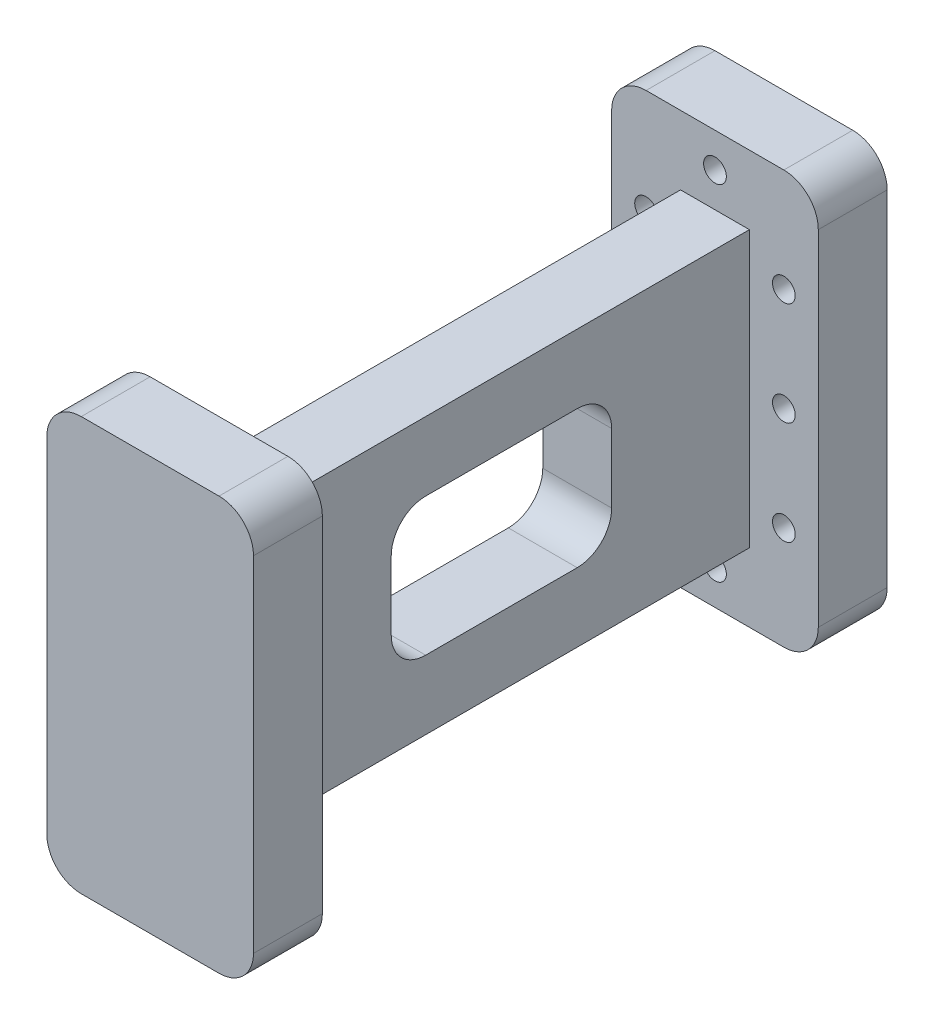
ISO-10303-21;
HEADER;
FILE_DESCRIPTION(('STEP AP214'),'2;1');
FILE_NAME('part.step','',(''),(''),'','','');
FILE_SCHEMA(('AUTOMOTIVE_DESIGN { 1 0 10303 214 1 1 1 1 }'));
ENDSEC;
DATA;
#1=APPLICATION_CONTEXT('core data for automotive mechanical design processes');
#2=APPLICATION_PROTOCOL_DEFINITION('international standard','automotive_design',2000,#1);
#3=PRODUCT_CONTEXT('',#1,'mechanical');
#4=PRODUCT('Part','Part','',(#3));
#5=PRODUCT_RELATED_PRODUCT_CATEGORY('part','',(#4));
#6=PRODUCT_DEFINITION_FORMATION('','',#4);
#7=PRODUCT_DEFINITION_CONTEXT('part definition',#1,'design');
#8=PRODUCT_DEFINITION('design','',#6,#7);
#9=PRODUCT_DEFINITION_SHAPE('','',#8);
#10=(LENGTH_UNIT() NAMED_UNIT(*) SI_UNIT(.MILLI.,.METRE.));
#11=(NAMED_UNIT(*) PLANE_ANGLE_UNIT() SI_UNIT($,.RADIAN.));
#12=(NAMED_UNIT(*) SI_UNIT($,.STERADIAN.) SOLID_ANGLE_UNIT());
#13=UNCERTAINTY_MEASURE_WITH_UNIT(LENGTH_MEASURE(1.E-05),#10,'distance_accuracy_value','');
#14=(GEOMETRIC_REPRESENTATION_CONTEXT(3) GLOBAL_UNCERTAINTY_ASSIGNED_CONTEXT((#13)) GLOBAL_UNIT_ASSIGNED_CONTEXT((#10,
#11,#12)) REPRESENTATION_CONTEXT('',''));
#15=CARTESIAN_POINT('',(0.,0.,0.));
#16=DIRECTION('',(0.,0.,1.));
#17=DIRECTION('',(1.,0.,0.));
#18=AXIS2_PLACEMENT_3D('',#15,#16,#17);
#19=CARTESIAN_POINT('',(-9.99999999999996,-30.,92.));
#20=DIRECTION('',(0.,1.,0.));
#21=DIRECTION('',(0.,0.,1.));
#22=AXIS2_PLACEMENT_3D('',#19,#20,#21);
#23=PLANE('',#22);
#24=DIRECTION('',(0.,0.,-1.));
#25=VECTOR('',#24,1.);
#26=CARTESIAN_POINT('',(9.99999999999997,-30.,92.));
#27=LINE('',#26,#25);
#28=CARTESIAN_POINT('',(9.99999999999997,-30.,9.99999999999999));
#29=VERTEX_POINT('',#28);
#30=CARTESIAN_POINT('',(9.99999999999997,-30.,0.));
#31=VERTEX_POINT('',#30);
#32=EDGE_CURVE('E261',#29,#31,#27,.T.);
#33=ORIENTED_EDGE('',*,*,#32,.F.);
#34=DIRECTION('',(-1.,0.,0.));
#35=VECTOR('',#34,1.);
#36=CARTESIAN_POINT('',(5.,-30.,9.99999999999999));
#37=LINE('',#36,#35);
#38=CARTESIAN_POINT('',(-9.99999999999996,-30.,9.99999999999999));
#39=VERTEX_POINT('',#38);
#40=EDGE_CURVE('E534',#29,#39,#37,.T.);
#41=ORIENTED_EDGE('',*,*,#40,.T.);
#42=DIRECTION('',(0.,0.,-1.));
#43=VECTOR('',#42,1.);
#44=CARTESIAN_POINT('',(-9.99999999999996,-30.,92.));
#45=LINE('',#44,#43);
#46=CARTESIAN_POINT('',(-9.99999999999996,-30.,0.));
#47=VERTEX_POINT('',#46);
#48=EDGE_CURVE('E265',#39,#47,#45,.T.);
#49=ORIENTED_EDGE('',*,*,#48,.T.);
#50=DIRECTION('',(1.,0.,0.));
#51=VECTOR('',#50,1.);
#52=CARTESIAN_POINT('',(-9.99999999999996,-30.,0.));
#53=LINE('',#52,#51);
#54=EDGE_CURVE('E300',#47,#31,#53,.T.);
#55=ORIENTED_EDGE('',*,*,#54,.T.);
#56=EDGE_LOOP('',(#33,#41,#49,#55));
#57=FACE_BOUND('',#56,.T.);
#58=ADVANCED_FACE('F39',(#57),#23,.F.);
#59=CARTESIAN_POINT('',(10.,-25.,92.));
#60=DIRECTION('',(0.,0.,-1.));
#61=DIRECTION('',(-1.,0.,0.));
#62=AXIS2_PLACEMENT_3D('',#59,#60,#61);
#63=CYLINDRICAL_SURFACE('',#62,5.);
#64=CARTESIAN_POINT('',(10.,-25.,9.99999999999999));
#65=DIRECTION('',(0.,0.,1.));
#66=DIRECTION('',(1.,0.,0.));
#67=AXIS2_PLACEMENT_3D('',#64,#65,#66);
#68=CIRCLE('',#67,5.);
#69=CARTESIAN_POINT('',(15.,-25.,10.));
#70=VERTEX_POINT('',#69);
#71=EDGE_CURVE('E233',#29,#70,#68,.T.);
#72=ORIENTED_EDGE('',*,*,#71,.F.);
#73=ORIENTED_EDGE('',*,*,#32,.T.);
#74=CARTESIAN_POINT('',(10.,-25.,0.));
#75=DIRECTION('',(0.,0.,1.));
#76=DIRECTION('',(1.,0.,0.));
#77=AXIS2_PLACEMENT_3D('',#74,#75,#76);
#78=CIRCLE('',#77,5.);
#79=CARTESIAN_POINT('',(15.,-25.,0.));
#80=VERTEX_POINT('',#79);
#81=EDGE_CURVE('E302',#31,#80,#78,.T.);
#82=ORIENTED_EDGE('',*,*,#81,.T.);
#83=DIRECTION('',(0.,0.,-1.));
#84=VECTOR('',#83,1.);
#85=CARTESIAN_POINT('',(15.,-25.,92.));
#86=LINE('',#85,#84);
#87=EDGE_CURVE('E253',#70,#80,#86,.T.);
#88=ORIENTED_EDGE('',*,*,#87,.F.);
#89=EDGE_LOOP('',(#72,#73,#82,#88));
#90=FACE_BOUND('',#89,.T.);
#91=ADVANCED_FACE('F572',(#90),#63,.T.);
#92=CARTESIAN_POINT('',(10.,25.,92.));
#93=DIRECTION('',(0.,0.,-1.));
#94=DIRECTION('',(-1.,0.,0.));
#95=AXIS2_PLACEMENT_3D('',#92,#93,#94);
#96=CYLINDRICAL_SURFACE('',#95,5.);
#97=CARTESIAN_POINT('',(10.,25.,9.99999999999999));
#98=DIRECTION('',(0.,0.,1.));
#99=DIRECTION('',(1.,0.,0.));
#100=AXIS2_PLACEMENT_3D('',#97,#98,#99);
#101=CIRCLE('',#100,5.);
#102=CARTESIAN_POINT('',(15.,25.,10.));
#103=VERTEX_POINT('',#102);
#104=CARTESIAN_POINT('',(9.99999999999997,30.,9.99999999999999));
#105=VERTEX_POINT('',#104);
#106=EDGE_CURVE('E224',#103,#105,#101,.T.);
#107=ORIENTED_EDGE('',*,*,#106,.F.);
#108=DIRECTION('',(0.,0.,-1.));
#109=VECTOR('',#108,1.);
#110=CARTESIAN_POINT('',(15.,25.,92.));
#111=LINE('',#110,#109);
#112=CARTESIAN_POINT('',(15.,25.,0.));
#113=VERTEX_POINT('',#112);
#114=EDGE_CURVE('E229',#103,#113,#111,.T.);
#115=ORIENTED_EDGE('',*,*,#114,.T.);
#116=CARTESIAN_POINT('',(10.,25.,0.));
#117=DIRECTION('',(0.,0.,1.));
#118=DIRECTION('',(-1.,0.,0.));
#119=AXIS2_PLACEMENT_3D('',#116,#117,#118);
#120=CIRCLE('',#119,5.);
#121=CARTESIAN_POINT('',(9.99999999999997,30.,0.));
#122=VERTEX_POINT('',#121);
#123=EDGE_CURVE('E309',#113,#122,#120,.T.);
#124=ORIENTED_EDGE('',*,*,#123,.T.);
#125=DIRECTION('',(0.,0.,-1.));
#126=VECTOR('',#125,1.);
#127=CARTESIAN_POINT('',(9.99999999999997,30.,92.));
#128=LINE('',#127,#126);
#129=EDGE_CURVE('E231',#105,#122,#128,.T.);
#130=ORIENTED_EDGE('',*,*,#129,.F.);
#131=EDGE_LOOP('',(#107,#115,#124,#130));
#132=FACE_BOUND('',#131,.T.);
#133=ADVANCED_FACE('F226',(#132),#96,.T.);
#134=CARTESIAN_POINT('',(-9.99999999999996,30.,92.));
#135=DIRECTION('',(0.,-1.,0.));
#136=DIRECTION('',(0.,0.,-1.));
#137=AXIS2_PLACEMENT_3D('',#134,#135,#136);
#138=PLANE('',#137);
#139=DIRECTION('',(-1.,0.,0.));
#140=VECTOR('',#139,1.);
#141=CARTESIAN_POINT('',(5.,30.,10.));
#142=LINE('',#141,#140);
#143=CARTESIAN_POINT('',(-9.99999999999996,30.,9.99999999999999));
#144=VERTEX_POINT('',#143);
#145=EDGE_CURVE('E336',#105,#144,#142,.T.);
#146=ORIENTED_EDGE('',*,*,#145,.F.);
#147=ORIENTED_EDGE('',*,*,#129,.T.);
#148=DIRECTION('',(-1.,0.,0.));
#149=VECTOR('',#148,1.);
#150=CARTESIAN_POINT('',(-9.99999999999996,30.,0.));
#151=LINE('',#150,#149);
#152=CARTESIAN_POINT('',(-9.99999999999996,30.,0.));
#153=VERTEX_POINT('',#152);
#154=EDGE_CURVE('E311',#122,#153,#151,.T.);
#155=ORIENTED_EDGE('',*,*,#154,.T.);
#156=DIRECTION('',(0.,0.,-1.));
#157=VECTOR('',#156,1.);
#158=CARTESIAN_POINT('',(-9.99999999999996,30.,92.));
#159=LINE('',#158,#157);
#160=EDGE_CURVE('E316',#144,#153,#159,.T.);
#161=ORIENTED_EDGE('',*,*,#160,.F.);
#162=EDGE_LOOP('',(#146,#147,#155,#161));
#163=FACE_BOUND('',#162,.T.);
#164=ADVANCED_FACE('F335',(#163),#138,.F.);
#165=CARTESIAN_POINT('',(-10.,25.,92.));
#166=DIRECTION('',(0.,0.,-1.));
#167=DIRECTION('',(-1.,0.,0.));
#168=AXIS2_PLACEMENT_3D('',#165,#166,#167);
#169=CYLINDRICAL_SURFACE('',#168,5.);
#170=DIRECTION('',(0.,0.,-1.));
#171=VECTOR('',#170,1.);
#172=CARTESIAN_POINT('',(-15.,25.,92.));
#173=LINE('',#172,#171);
#174=CARTESIAN_POINT('',(-15.,25.,10.));
#175=VERTEX_POINT('',#174);
#176=CARTESIAN_POINT('',(-15.,25.,0.));
#177=VERTEX_POINT('',#176);
#178=EDGE_CURVE('E47',#175,#177,#173,.T.);
#179=ORIENTED_EDGE('',*,*,#178,.F.);
#180=CARTESIAN_POINT('',(-10.,25.,9.99999999999999));
#181=DIRECTION('',(0.,0.,-1.));
#182=DIRECTION('',(-1.,0.,0.));
#183=AXIS2_PLACEMENT_3D('',#180,#181,#182);
#184=CIRCLE('',#183,5.);
#185=EDGE_CURVE('E409',#175,#144,#184,.T.);
#186=ORIENTED_EDGE('',*,*,#185,.T.);
#187=ORIENTED_EDGE('',*,*,#160,.T.);
#188=CARTESIAN_POINT('',(-10.,25.,0.));
#189=DIRECTION('',(0.,0.,1.));
#190=DIRECTION('',(-1.,0.,0.));
#191=AXIS2_PLACEMENT_3D('',#188,#189,#190);
#192=CIRCLE('',#191,5.);
#193=EDGE_CURVE('E242',#153,#177,#192,.T.);
#194=ORIENTED_EDGE('',*,*,#193,.T.);
#195=EDGE_LOOP('',(#179,#186,#187,#194));
#196=FACE_BOUND('',#195,.T.);
#197=ADVANCED_FACE('F332',(#196),#169,.T.);
#198=CARTESIAN_POINT('',(-10.,-25.,92.));
#199=DIRECTION('',(0.,0.,-1.));
#200=DIRECTION('',(-1.,0.,0.));
#201=AXIS2_PLACEMENT_3D('',#198,#199,#200);
#202=CYLINDRICAL_SURFACE('',#201,5.);
#203=ORIENTED_EDGE('',*,*,#48,.F.);
#204=CARTESIAN_POINT('',(-10.,-25.,9.99999999999999));
#205=DIRECTION('',(0.,0.,-1.));
#206=DIRECTION('',(-1.,0.,0.));
#207=AXIS2_PLACEMENT_3D('',#204,#205,#206);
#208=CIRCLE('',#207,5.);
#209=CARTESIAN_POINT('',(-15.,-25.,10.));
#210=VERTEX_POINT('',#209);
#211=EDGE_CURVE('E285',#39,#210,#208,.T.);
#212=ORIENTED_EDGE('',*,*,#211,.T.);
#213=DIRECTION('',(0.,0.,-1.));
#214=VECTOR('',#213,1.);
#215=CARTESIAN_POINT('',(-15.,-25.,92.));
#216=LINE('',#215,#214);
#217=CARTESIAN_POINT('',(-15.,-25.,0.));
#218=VERTEX_POINT('',#217);
#219=EDGE_CURVE('E268',#210,#218,#216,.T.);
#220=ORIENTED_EDGE('',*,*,#219,.T.);
#221=CARTESIAN_POINT('',(-10.,-25.,0.));
#222=DIRECTION('',(0.,0.,1.));
#223=DIRECTION('',(-1.,0.,0.));
#224=AXIS2_PLACEMENT_3D('',#221,#222,#223);
#225=CIRCLE('',#224,5.);
#226=EDGE_CURVE('E282',#218,#47,#225,.T.);
#227=ORIENTED_EDGE('',*,*,#226,.T.);
#228=EDGE_LOOP('',(#203,#212,#220,#227));
#229=FACE_BOUND('',#228,.T.);
#230=ADVANCED_FACE('F280',(#229),#202,.T.);
#231=CARTESIAN_POINT('',(5.,0.,0.));
#232=DIRECTION('',(1.,0.,0.));
#233=DIRECTION('',(0.,0.,-1.));
#234=AXIS2_PLACEMENT_3D('',#231,#232,#233);
#235=PLANE('',#234);
#236=DIRECTION('',(0.,0.,-1.));
#237=VECTOR('',#236,1.);
#238=CARTESIAN_POINT('',(5.,10.,0.));
#239=LINE('',#238,#237);
#240=CARTESIAN_POINT('',(5.,10.,57.));
#241=VERTEX_POINT('',#240);
#242=CARTESIAN_POINT('',(5.,10.,35.));
#243=VERTEX_POINT('',#242);
#244=EDGE_CURVE('E420',#241,#243,#239,.T.);
#245=ORIENTED_EDGE('',*,*,#244,.T.);
#246=CARTESIAN_POINT('',(5.,5.,35.));
#247=DIRECTION('',(-1.,0.,0.));
#248=DIRECTION('',(0.,0.,1.));
#249=AXIS2_PLACEMENT_3D('',#246,#247,#248);
#250=CIRCLE('',#249,5.);
#251=CARTESIAN_POINT('',(5.,5.,30.));
#252=VERTEX_POINT('',#251);
#253=EDGE_CURVE('E423',#243,#252,#250,.T.);
#254=ORIENTED_EDGE('',*,*,#253,.T.);
#255=DIRECTION('',(0.,-1.,0.));
#256=VECTOR('',#255,1.);
#257=CARTESIAN_POINT('',(5.,0.,30.));
#258=LINE('',#257,#256);
#259=CARTESIAN_POINT('',(5.,-4.99999999999997,30.));
#260=VERTEX_POINT('',#259);
#261=EDGE_CURVE('E54',#252,#260,#258,.T.);
#262=ORIENTED_EDGE('',*,*,#261,.T.);
#263=CARTESIAN_POINT('',(5.,-5.,35.));
#264=DIRECTION('',(-1.,0.,0.));
#265=DIRECTION('',(0.,0.,1.));
#266=AXIS2_PLACEMENT_3D('',#263,#264,#265);
#267=CIRCLE('',#266,5.);
#268=CARTESIAN_POINT('',(5.,-10.,35.));
#269=VERTEX_POINT('',#268);
#270=EDGE_CURVE('E428',#260,#269,#267,.T.);
#271=ORIENTED_EDGE('',*,*,#270,.T.);
#272=DIRECTION('',(0.,0.,1.));
#273=VECTOR('',#272,1.);
#274=CARTESIAN_POINT('',(5.,-10.,0.));
#275=LINE('',#274,#273);
#276=CARTESIAN_POINT('',(5.,-10.,57.));
#277=VERTEX_POINT('',#276);
#278=EDGE_CURVE('E431',#269,#277,#275,.T.);
#279=ORIENTED_EDGE('',*,*,#278,.T.);
#280=CARTESIAN_POINT('',(5.,-5.,57.));
#281=DIRECTION('',(-1.,0.,0.));
#282=DIRECTION('',(0.,0.,1.));
#283=AXIS2_PLACEMENT_3D('',#280,#281,#282);
#284=CIRCLE('',#283,5.);
#285=CARTESIAN_POINT('',(5.,-4.99999999999997,62.));
#286=VERTEX_POINT('',#285);
#287=EDGE_CURVE('E434',#277,#286,#284,.T.);
#288=ORIENTED_EDGE('',*,*,#287,.T.);
#289=DIRECTION('',(0.,1.,0.));
#290=VECTOR('',#289,1.);
#291=CARTESIAN_POINT('',(5.,0.,62.));
#292=LINE('',#291,#290);
#293=CARTESIAN_POINT('',(5.,4.99999999999996,62.));
#294=VERTEX_POINT('',#293);
#295=EDGE_CURVE('E437',#286,#294,#292,.T.);
#296=ORIENTED_EDGE('',*,*,#295,.T.);
#297=CARTESIAN_POINT('',(5.,5.,57.));
#298=DIRECTION('',(-1.,0.,0.));
#299=DIRECTION('',(0.,0.,1.));
#300=AXIS2_PLACEMENT_3D('',#297,#298,#299);
#301=CIRCLE('',#300,5.);
#302=EDGE_CURVE('E440',#294,#241,#301,.T.);
#303=ORIENTED_EDGE('',*,*,#302,.T.);
#304=EDGE_LOOP('',(#245,#254,#262,#271,#279,#288,#296,#303));
#305=FACE_BOUND('',#304,.T.);
#306=DIRECTION('',(0.,0.,-1.));
#307=VECTOR('',#306,1.);
#308=CARTESIAN_POINT('',(5.,-20.,9.99999999999999));
#309=LINE('',#308,#307);
#310=CARTESIAN_POINT('',(5.,-20.,82.));
#311=VERTEX_POINT('',#310);
#312=CARTESIAN_POINT('',(5.,-20.,9.99999999999999));
#313=VERTEX_POINT('',#312);
#314=EDGE_CURVE('E529',#311,#313,#309,.T.);
#315=ORIENTED_EDGE('',*,*,#314,.T.);
#316=DIRECTION('',(0.,-1.,0.));
#317=VECTOR('',#316,1.);
#318=CARTESIAN_POINT('',(5.,0.,10.));
#319=LINE('',#318,#317);
#320=CARTESIAN_POINT('',(5.,20.,10.));
#321=VERTEX_POINT('',#320);
#322=EDGE_CURVE('E354',#321,#313,#319,.T.);
#323=ORIENTED_EDGE('',*,*,#322,.F.);
#324=DIRECTION('',(0.,0.,1.));
#325=VECTOR('',#324,1.);
#326=CARTESIAN_POINT('',(5.,20.,82.));
#327=LINE('',#326,#325);
#328=CARTESIAN_POINT('',(5.,20.,82.));
#329=VERTEX_POINT('',#328);
#330=EDGE_CURVE('E338',#321,#329,#327,.T.);
#331=ORIENTED_EDGE('',*,*,#330,.T.);
#332=DIRECTION('',(0.,-1.,0.));
#333=VECTOR('',#332,1.);
#334=CARTESIAN_POINT('',(5.,0.,82.));
#335=LINE('',#334,#333);
#336=EDGE_CURVE('E362',#329,#311,#335,.T.);
#337=ORIENTED_EDGE('',*,*,#336,.T.);
#338=EDGE_LOOP('',(#315,#323,#331,#337));
#339=FACE_BOUND('',#338,.T.);
#340=ADVANCED_FACE('F558',(#305,#339),#235,.T.);
#341=CARTESIAN_POINT('',(-15.,-25.,92.));
#342=DIRECTION('',(1.,0.,0.));
#343=DIRECTION('',(0.,0.,-1.));
#344=AXIS2_PLACEMENT_3D('',#341,#342,#343);
#345=PLANE('',#344);
#346=DIRECTION('',(0.,-1.,0.));
#347=VECTOR('',#346,1.);
#348=CARTESIAN_POINT('',(-15.,0.,82.));
#349=LINE('',#348,#347);
#350=CARTESIAN_POINT('',(-15.,25.,82.));
#351=VERTEX_POINT('',#350);
#352=CARTESIAN_POINT('',(-15.,-25.,82.));
#353=VERTEX_POINT('',#352);
#354=EDGE_CURVE('E355',#351,#353,#349,.T.);
#355=ORIENTED_EDGE('',*,*,#354,.T.);
#356=CARTESIAN_POINT('',(-15.,-25.,92.));
#357=VERTEX_POINT('',#356);
#358=EDGE_CURVE('E269',#357,#353,#216,.T.);
#359=ORIENTED_EDGE('',*,*,#358,.F.);
#360=DIRECTION('',(0.,-1.,0.));
#361=VECTOR('',#360,1.);
#362=CARTESIAN_POINT('',(-15.,-25.,92.));
#363=LINE('',#362,#361);
#364=CARTESIAN_POINT('',(-15.,25.,92.));
#365=VERTEX_POINT('',#364);
#366=EDGE_CURVE('E368',#365,#357,#363,.T.);
#367=ORIENTED_EDGE('',*,*,#366,.F.);
#368=EDGE_CURVE('E12',#365,#351,#173,.T.);
#369=ORIENTED_EDGE('',*,*,#368,.T.);
#370=EDGE_LOOP('',(#355,#359,#367,#369));
#371=FACE_BOUND('',#370,.T.);
#372=ADVANCED_FACE('F395',(#371),#345,.F.);
#373=CARTESIAN_POINT('',(15.,-25.,92.));
#374=DIRECTION('',(-1.,0.,0.));
#375=DIRECTION('',(0.,0.,1.));
#376=AXIS2_PLACEMENT_3D('',#373,#374,#375);
#377=PLANE('',#376);
#378=DIRECTION('',(0.,-1.,0.));
#379=VECTOR('',#378,1.);
#380=CARTESIAN_POINT('',(15.,-25.,82.));
#381=LINE('',#380,#379);
#382=CARTESIAN_POINT('',(15.,25.,82.));
#383=VERTEX_POINT('',#382);
#384=CARTESIAN_POINT('',(15.,-25.,82.));
#385=VERTEX_POINT('',#384);
#386=EDGE_CURVE('E243',#383,#385,#381,.T.);
#387=ORIENTED_EDGE('',*,*,#386,.F.);
#388=CARTESIAN_POINT('',(15.,25.,92.));
#389=VERTEX_POINT('',#388);
#390=EDGE_CURVE('E249',#389,#383,#111,.T.);
#391=ORIENTED_EDGE('',*,*,#390,.F.);
#392=DIRECTION('',(0.,1.,0.));
#393=VECTOR('',#392,1.);
#394=CARTESIAN_POINT('',(15.,-25.,92.));
#395=LINE('',#394,#393);
#396=CARTESIAN_POINT('',(15.,-25.,92.));
#397=VERTEX_POINT('',#396);
#398=EDGE_CURVE('E329',#397,#389,#395,.T.);
#399=ORIENTED_EDGE('',*,*,#398,.F.);
#400=EDGE_CURVE('E258',#397,#385,#86,.T.);
#401=ORIENTED_EDGE('',*,*,#400,.T.);
#402=EDGE_LOOP('',(#387,#391,#399,#401));
#403=FACE_BOUND('',#402,.T.);
#404=ADVANCED_FACE('F384',(#403),#377,.F.);
#405=CARTESIAN_POINT('',(-9.99999999999996,30.,92.));
#406=VERTEX_POINT('',#405);
#407=CARTESIAN_POINT('',(-9.99999999999996,30.,82.));
#408=VERTEX_POINT('',#407);
#409=EDGE_CURVE('E314',#406,#408,#159,.T.);
#410=ORIENTED_EDGE('',*,*,#409,.T.);
#411=CARTESIAN_POINT('',(-10.,25.,82.));
#412=DIRECTION('',(0.,0.,1.));
#413=DIRECTION('',(1.,0.,0.));
#414=AXIS2_PLACEMENT_3D('',#411,#412,#413);
#415=CIRCLE('',#414,5.);
#416=EDGE_CURVE('E417',#408,#351,#415,.T.);
#417=ORIENTED_EDGE('',*,*,#416,.T.);
#418=ORIENTED_EDGE('',*,*,#368,.F.);
#419=CARTESIAN_POINT('',(-10.,25.,92.));
#420=DIRECTION('',(0.,0.,1.));
#421=DIRECTION('',(-1.,0.,0.));
#422=AXIS2_PLACEMENT_3D('',#419,#420,#421);
#423=CIRCLE('',#422,5.);
#424=EDGE_CURVE('E313',#406,#365,#423,.T.);
#425=ORIENTED_EDGE('',*,*,#424,.F.);
#426=EDGE_LOOP('',(#410,#417,#418,#425));
#427=FACE_BOUND('',#426,.T.);
#428=ADVANCED_FACE('F41',(#427),#169,.T.);
#429=ORIENTED_EDGE('',*,*,#219,.F.);
#430=DIRECTION('',(0.,-1.,0.));
#431=VECTOR('',#430,1.);
#432=CARTESIAN_POINT('',(-15.,0.,10.));
#433=LINE('',#432,#431);
#434=EDGE_CURVE('E351',#175,#210,#433,.T.);
#435=ORIENTED_EDGE('',*,*,#434,.F.);
#436=ORIENTED_EDGE('',*,*,#178,.T.);
#437=DIRECTION('',(0.,-1.,0.));
#438=VECTOR('',#437,1.);
#439=CARTESIAN_POINT('',(-15.,-25.,0.));
#440=LINE('',#439,#438);
#441=EDGE_CURVE('E290',#177,#218,#440,.T.);
#442=ORIENTED_EDGE('',*,*,#441,.T.);
#443=EDGE_LOOP('',(#429,#435,#436,#442));
#444=FACE_BOUND('',#443,.T.);
#445=ADVANCED_FACE('F291',(#444),#345,.F.);
#446=ORIENTED_EDGE('',*,*,#358,.T.);
#447=CARTESIAN_POINT('',(-10.,-25.,82.));
#448=DIRECTION('',(0.,0.,1.));
#449=DIRECTION('',(1.,0.,0.));
#450=AXIS2_PLACEMENT_3D('',#447,#448,#449);
#451=CIRCLE('',#450,5.);
#452=CARTESIAN_POINT('',(-9.99999999999996,-30.,82.));
#453=VERTEX_POINT('',#452);
#454=EDGE_CURVE('E399',#353,#453,#451,.T.);
#455=ORIENTED_EDGE('',*,*,#454,.T.);
#456=CARTESIAN_POINT('',(-9.99999999999996,-30.,92.));
#457=VERTEX_POINT('',#456);
#458=EDGE_CURVE('E266',#457,#453,#45,.T.);
#459=ORIENTED_EDGE('',*,*,#458,.F.);
#460=CARTESIAN_POINT('',(-10.,-25.,92.));
#461=DIRECTION('',(0.,0.,1.));
#462=DIRECTION('',(-1.,0.,0.));
#463=AXIS2_PLACEMENT_3D('',#460,#461,#462);
#464=CIRCLE('',#463,5.);
#465=EDGE_CURVE('E370',#357,#457,#464,.T.);
#466=ORIENTED_EDGE('',*,*,#465,.F.);
#467=EDGE_LOOP('',(#446,#455,#459,#466));
#468=FACE_BOUND('',#467,.T.);
#469=ADVANCED_FACE('F397',(#468),#202,.T.);
#470=DIRECTION('',(-1.,0.,0.));
#471=VECTOR('',#470,1.);
#472=CARTESIAN_POINT('',(5.,-30.,82.));
#473=LINE('',#472,#471);
#474=CARTESIAN_POINT('',(9.99999999999997,-30.,82.));
#475=VERTEX_POINT('',#474);
#476=EDGE_CURVE('E403',#475,#453,#473,.T.);
#477=ORIENTED_EDGE('',*,*,#476,.F.);
#478=CARTESIAN_POINT('',(9.99999999999997,-30.,92.));
#479=VERTEX_POINT('',#478);
#480=EDGE_CURVE('E262',#479,#475,#27,.T.);
#481=ORIENTED_EDGE('',*,*,#480,.F.);
#482=DIRECTION('',(1.,0.,0.));
#483=VECTOR('',#482,1.);
#484=CARTESIAN_POINT('',(-9.99999999999996,-30.,92.));
#485=LINE('',#484,#483);
#486=EDGE_CURVE('E372',#457,#479,#485,.T.);
#487=ORIENTED_EDGE('',*,*,#486,.F.);
#488=ORIENTED_EDGE('',*,*,#458,.T.);
#489=EDGE_LOOP('',(#477,#481,#487,#488));
#490=FACE_BOUND('',#489,.T.);
#491=ADVANCED_FACE('F402',(#490),#23,.F.);
#492=ORIENTED_EDGE('',*,*,#480,.T.);
#493=CARTESIAN_POINT('',(10.,-25.,82.));
#494=DIRECTION('',(0.,0.,1.));
#495=DIRECTION('',(1.,0.,0.));
#496=AXIS2_PLACEMENT_3D('',#493,#494,#495);
#497=CIRCLE('',#496,5.);
#498=EDGE_CURVE('E407',#475,#385,#497,.T.);
#499=ORIENTED_EDGE('',*,*,#498,.T.);
#500=ORIENTED_EDGE('',*,*,#400,.F.);
#501=CARTESIAN_POINT('',(10.,-25.,92.));
#502=DIRECTION('',(0.,0.,1.));
#503=DIRECTION('',(1.,0.,0.));
#504=AXIS2_PLACEMENT_3D('',#501,#502,#503);
#505=CIRCLE('',#504,5.);
#506=EDGE_CURVE('E374',#479,#397,#505,.T.);
#507=ORIENTED_EDGE('',*,*,#506,.F.);
#508=EDGE_LOOP('',(#492,#499,#500,#507));
#509=FACE_BOUND('',#508,.T.);
#510=ADVANCED_FACE('F406',(#509),#63,.T.);
#511=ORIENTED_EDGE('',*,*,#114,.F.);
#512=DIRECTION('',(0.,-1.,0.));
#513=VECTOR('',#512,1.);
#514=CARTESIAN_POINT('',(15.,-25.,9.99999999999999));
#515=LINE('',#514,#513);
#516=EDGE_CURVE('E236',#103,#70,#515,.T.);
#517=ORIENTED_EDGE('',*,*,#516,.T.);
#518=ORIENTED_EDGE('',*,*,#87,.T.);
#519=DIRECTION('',(0.,1.,0.));
#520=VECTOR('',#519,1.);
#521=CARTESIAN_POINT('',(15.,-25.,0.));
#522=LINE('',#521,#520);
#523=EDGE_CURVE('E247',#80,#113,#522,.T.);
#524=ORIENTED_EDGE('',*,*,#523,.T.);
#525=EDGE_LOOP('',(#511,#517,#518,#524));
#526=FACE_BOUND('',#525,.T.);
#527=ADVANCED_FACE('F245',(#526),#377,.F.);
#528=ORIENTED_EDGE('',*,*,#390,.T.);
#529=CARTESIAN_POINT('',(10.,25.,82.));
#530=DIRECTION('',(0.,0.,1.));
#531=DIRECTION('',(1.,0.,0.));
#532=AXIS2_PLACEMENT_3D('',#529,#530,#531);
#533=CIRCLE('',#532,5.);
#534=CARTESIAN_POINT('',(9.99999999999997,30.,82.));
#535=VERTEX_POINT('',#534);
#536=EDGE_CURVE('E388',#383,#535,#533,.T.);
#537=ORIENTED_EDGE('',*,*,#536,.T.);
#538=CARTESIAN_POINT('',(9.99999999999997,30.,92.));
#539=VERTEX_POINT('',#538);
#540=EDGE_CURVE('E250',#539,#535,#128,.T.);
#541=ORIENTED_EDGE('',*,*,#540,.F.);
#542=CARTESIAN_POINT('',(10.,25.,92.));
#543=DIRECTION('',(0.,0.,1.));
#544=DIRECTION('',(-1.,0.,0.));
#545=AXIS2_PLACEMENT_3D('',#542,#543,#544);
#546=CIRCLE('',#545,5.);
#547=EDGE_CURVE('E324',#389,#539,#546,.T.);
#548=ORIENTED_EDGE('',*,*,#547,.F.);
#549=EDGE_LOOP('',(#528,#537,#541,#548));
#550=FACE_BOUND('',#549,.T.);
#551=ADVANCED_FACE('F387',(#550),#96,.T.);
#552=ORIENTED_EDGE('',*,*,#540,.T.);
#553=DIRECTION('',(-1.,0.,0.));
#554=VECTOR('',#553,1.);
#555=CARTESIAN_POINT('',(5.,30.,82.));
#556=LINE('',#555,#554);
#557=EDGE_CURVE('E358',#535,#408,#556,.T.);
#558=ORIENTED_EDGE('',*,*,#557,.T.);
#559=ORIENTED_EDGE('',*,*,#409,.F.);
#560=DIRECTION('',(-1.,0.,0.));
#561=VECTOR('',#560,1.);
#562=CARTESIAN_POINT('',(-9.99999999999996,30.,92.));
#563=LINE('',#562,#561);
#564=EDGE_CURVE('E320',#539,#406,#563,.T.);
#565=ORIENTED_EDGE('',*,*,#564,.F.);
#566=EDGE_LOOP('',(#552,#558,#559,#565));
#567=FACE_BOUND('',#566,.T.);
#568=ADVANCED_FACE('F390',(#567),#138,.F.);
#569=CARTESIAN_POINT('',(-10.,25.,92.));
#570=DIRECTION('',(0.,0.,-1.));
#571=DIRECTION('',(-1.,0.,0.));
#572=AXIS2_PLACEMENT_3D('',#569,#570,#571);
#573=PLANE('',#572);
#574=ORIENTED_EDGE('',*,*,#424,.T.);
#575=ORIENTED_EDGE('',*,*,#366,.T.);
#576=ORIENTED_EDGE('',*,*,#465,.T.);
#577=ORIENTED_EDGE('',*,*,#486,.T.);
#578=ORIENTED_EDGE('',*,*,#506,.T.);
#579=ORIENTED_EDGE('',*,*,#398,.T.);
#580=ORIENTED_EDGE('',*,*,#547,.T.);
#581=ORIENTED_EDGE('',*,*,#564,.T.);
#582=EDGE_LOOP('',(#574,#575,#576,#577,#578,#579,#580,#581));
#583=FACE_BOUND('',#582,.T.);
#584=ADVANCED_FACE('F377',(#583),#573,.F.);
#585=CARTESIAN_POINT('',(-10.,25.,0.));
#586=DIRECTION('',(0.,0.,-1.));
#587=DIRECTION('',(-1.,0.,0.));
#588=AXIS2_PLACEMENT_3D('',#585,#586,#587);
#589=PLANE('',#588);
#590=CARTESIAN_POINT('',(0.,-25.,0.));
#591=DIRECTION('',(0.,0.,1.));
#592=DIRECTION('',(1.,0.,0.));
#593=AXIS2_PLACEMENT_3D('',#590,#591,#592);
#594=CIRCLE('',#593,1.65);
#595=CARTESIAN_POINT('',(1.65,-25.,0.));
#596=VERTEX_POINT('',#595);
#597=EDGE_CURVE('E483',#596,#596,#594,.T.);
#598=ORIENTED_EDGE('',*,*,#597,.T.);
#599=EDGE_LOOP('',(#598));
#600=FACE_BOUND('',#599,.T.);
#601=CARTESIAN_POINT('',(0.,25.,0.));
#602=DIRECTION('',(0.,0.,1.));
#603=DIRECTION('',(1.,0.,0.));
#604=AXIS2_PLACEMENT_3D('',#601,#602,#603);
#605=CIRCLE('',#604,1.65);
#606=CARTESIAN_POINT('',(1.65,25.,0.));
#607=VERTEX_POINT('',#606);
#608=EDGE_CURVE('E489',#607,#607,#605,.T.);
#609=ORIENTED_EDGE('',*,*,#608,.T.);
#610=EDGE_LOOP('',(#609));
#611=FACE_BOUND('',#610,.T.);
#612=CARTESIAN_POINT('',(-9.99999999999999,15.,0.));
#613=DIRECTION('',(0.,0.,1.));
#614=DIRECTION('',(1.,0.,0.));
#615=AXIS2_PLACEMENT_3D('',#612,#613,#614);
#616=CIRCLE('',#615,1.65);
#617=CARTESIAN_POINT('',(-8.35,15.,0.));
#618=VERTEX_POINT('',#617);
#619=EDGE_CURVE('E495',#618,#618,#616,.T.);
#620=ORIENTED_EDGE('',*,*,#619,.T.);
#621=EDGE_LOOP('',(#620));
#622=FACE_BOUND('',#621,.T.);
#623=CARTESIAN_POINT('',(-9.99999999999999,0.,0.));
#624=DIRECTION('',(0.,0.,1.));
#625=DIRECTION('',(1.,0.,0.));
#626=AXIS2_PLACEMENT_3D('',#623,#624,#625);
#627=CIRCLE('',#626,1.65);
#628=CARTESIAN_POINT('',(-8.35,0.,0.));
#629=VERTEX_POINT('',#628);
#630=EDGE_CURVE('E501',#629,#629,#627,.T.);
#631=ORIENTED_EDGE('',*,*,#630,.T.);
#632=EDGE_LOOP('',(#631));
#633=FACE_BOUND('',#632,.T.);
#634=CARTESIAN_POINT('',(-9.99999999999999,-15.,0.));
#635=DIRECTION('',(0.,0.,1.));
#636=DIRECTION('',(1.,0.,0.));
#637=AXIS2_PLACEMENT_3D('',#634,#635,#636);
#638=CIRCLE('',#637,1.65);
#639=CARTESIAN_POINT('',(-8.35,-15.,0.));
#640=VERTEX_POINT('',#639);
#641=EDGE_CURVE('E507',#640,#640,#638,.T.);
#642=ORIENTED_EDGE('',*,*,#641,.T.);
#643=EDGE_LOOP('',(#642));
#644=FACE_BOUND('',#643,.T.);
#645=CARTESIAN_POINT('',(10.,15.,0.));
#646=DIRECTION('',(0.,0.,1.));
#647=DIRECTION('',(1.,0.,0.));
#648=AXIS2_PLACEMENT_3D('',#645,#646,#647);
#649=CIRCLE('',#648,1.65);
#650=CARTESIAN_POINT('',(11.65,15.,0.));
#651=VERTEX_POINT('',#650);
#652=EDGE_CURVE('E513',#651,#651,#649,.T.);
#653=ORIENTED_EDGE('',*,*,#652,.T.);
#654=EDGE_LOOP('',(#653));
#655=FACE_BOUND('',#654,.T.);
#656=CARTESIAN_POINT('',(10.,0.,0.));
#657=DIRECTION('',(0.,0.,1.));
#658=DIRECTION('',(1.,0.,0.));
#659=AXIS2_PLACEMENT_3D('',#656,#657,#658);
#660=CIRCLE('',#659,1.65);
#661=CARTESIAN_POINT('',(11.65,0.,0.));
#662=VERTEX_POINT('',#661);
#663=EDGE_CURVE('E519',#662,#662,#660,.T.);
#664=ORIENTED_EDGE('',*,*,#663,.T.);
#665=EDGE_LOOP('',(#664));
#666=FACE_BOUND('',#665,.T.);
#667=CARTESIAN_POINT('',(10.,-15.,0.));
#668=DIRECTION('',(0.,0.,1.));
#669=DIRECTION('',(1.,0.,0.));
#670=AXIS2_PLACEMENT_3D('',#667,#668,#669);
#671=CIRCLE('',#670,1.65);
#672=CARTESIAN_POINT('',(11.65,-15.,0.));
#673=VERTEX_POINT('',#672);
#674=EDGE_CURVE('E525',#673,#673,#671,.T.);
#675=ORIENTED_EDGE('',*,*,#674,.T.);
#676=EDGE_LOOP('',(#675));
#677=FACE_BOUND('',#676,.T.);
#678=ORIENTED_EDGE('',*,*,#193,.F.);
#679=ORIENTED_EDGE('',*,*,#154,.F.);
#680=ORIENTED_EDGE('',*,*,#123,.F.);
#681=ORIENTED_EDGE('',*,*,#523,.F.);
#682=ORIENTED_EDGE('',*,*,#81,.F.);
#683=ORIENTED_EDGE('',*,*,#54,.F.);
#684=ORIENTED_EDGE('',*,*,#226,.F.);
#685=ORIENTED_EDGE('',*,*,#441,.F.);
#686=EDGE_LOOP('',(#678,#679,#680,#681,#682,#683,#684,#685));
#687=FACE_BOUND('',#686,.T.);
#688=ADVANCED_FACE('F297',(#600,#611,#622,#633,#644,#655,#666,#677,#687),#589,.T.);
#689=CARTESIAN_POINT('',(15.000012,0.,10.));
#690=DIRECTION('',(0.,0.,-1.));
#691=DIRECTION('',(-1.,0.,0.));
#692=AXIS2_PLACEMENT_3D('',#689,#690,#691);
#693=PLANE('',#692);
#694=DIRECTION('',(-1.,0.,0.));
#695=VECTOR('',#694,1.);
#696=CARTESIAN_POINT('',(5.,20.,10.));
#697=LINE('',#696,#695);
#698=CARTESIAN_POINT('',(-5.,20.,10.));
#699=VERTEX_POINT('',#698);
#700=EDGE_CURVE('E337',#321,#699,#697,.T.);
#701=ORIENTED_EDGE('',*,*,#700,.F.);
#702=ORIENTED_EDGE('',*,*,#322,.T.);
#703=DIRECTION('',(-1.,0.,0.));
#704=VECTOR('',#703,1.);
#705=CARTESIAN_POINT('',(5.,-20.,9.99999999999999));
#706=LINE('',#705,#704);
#707=CARTESIAN_POINT('',(-5.,-20.,9.99999999999999));
#708=VERTEX_POINT('',#707);
#709=EDGE_CURVE('E536',#313,#708,#706,.T.);
#710=ORIENTED_EDGE('',*,*,#709,.T.);
#711=DIRECTION('',(0.,-1.,0.));
#712=VECTOR('',#711,1.);
#713=CARTESIAN_POINT('',(-5.,0.,10.));
#714=LINE('',#713,#712);
#715=EDGE_CURVE('E350',#699,#708,#714,.T.);
#716=ORIENTED_EDGE('',*,*,#715,.F.);
#717=EDGE_LOOP('',(#701,#702,#710,#716));
#718=FACE_BOUND('',#717,.T.);
#719=ORIENTED_EDGE('',*,*,#71,.T.);
#720=ORIENTED_EDGE('',*,*,#516,.F.);
#721=ORIENTED_EDGE('',*,*,#106,.T.);
#722=ORIENTED_EDGE('',*,*,#145,.T.);
#723=ORIENTED_EDGE('',*,*,#185,.F.);
#724=ORIENTED_EDGE('',*,*,#434,.T.);
#725=ORIENTED_EDGE('',*,*,#211,.F.);
#726=ORIENTED_EDGE('',*,*,#40,.F.);
#727=EDGE_LOOP('',(#719,#720,#721,#722,#723,#724,#725,#726));
#728=FACE_BOUND('',#727,.T.);
#729=CARTESIAN_POINT('',(10.,-15.,10.));
#730=DIRECTION('',(0.,0.,1.));
#731=DIRECTION('',(1.,0.,0.));
#732=AXIS2_PLACEMENT_3D('',#729,#730,#731);
#733=CIRCLE('',#732,1.65);
#734=CARTESIAN_POINT('',(11.65,-15.,10.));
#735=VERTEX_POINT('',#734);
#736=EDGE_CURVE('E522',#735,#735,#733,.T.);
#737=ORIENTED_EDGE('',*,*,#736,.F.);
#738=EDGE_LOOP('',(#737));
#739=FACE_BOUND('',#738,.T.);
#740=CARTESIAN_POINT('',(10.,0.,10.));
#741=DIRECTION('',(0.,0.,1.));
#742=DIRECTION('',(1.,0.,0.));
#743=AXIS2_PLACEMENT_3D('',#740,#741,#742);
#744=CIRCLE('',#743,1.64999999999999);
#745=CARTESIAN_POINT('',(11.65,0.,10.));
#746=VERTEX_POINT('',#745);
#747=EDGE_CURVE('E516',#746,#746,#744,.T.);
#748=ORIENTED_EDGE('',*,*,#747,.F.);
#749=EDGE_LOOP('',(#748));
#750=FACE_BOUND('',#749,.T.);
#751=CARTESIAN_POINT('',(10.,15.,10.));
#752=DIRECTION('',(0.,0.,1.));
#753=DIRECTION('',(1.,0.,0.));
#754=AXIS2_PLACEMENT_3D('',#751,#752,#753);
#755=CIRCLE('',#754,1.64999999999999);
#756=CARTESIAN_POINT('',(11.65,15.,10.));
#757=VERTEX_POINT('',#756);
#758=EDGE_CURVE('E510',#757,#757,#755,.T.);
#759=ORIENTED_EDGE('',*,*,#758,.F.);
#760=EDGE_LOOP('',(#759));
#761=FACE_BOUND('',#760,.T.);
#762=CARTESIAN_POINT('',(0.,-25.,10.));
#763=DIRECTION('',(0.,0.,1.));
#764=DIRECTION('',(1.,0.,0.));
#765=AXIS2_PLACEMENT_3D('',#762,#763,#764);
#766=CIRCLE('',#765,1.64999999999999);
#767=CARTESIAN_POINT('',(1.64999999999999,-25.,10.));
#768=VERTEX_POINT('',#767);
#769=EDGE_CURVE('E467',#768,#768,#766,.T.);
#770=ORIENTED_EDGE('',*,*,#769,.F.);
#771=EDGE_LOOP('',(#770));
#772=FACE_BOUND('',#771,.T.);
#773=CARTESIAN_POINT('',(0.,25.,10.));
#774=DIRECTION('',(0.,0.,1.));
#775=DIRECTION('',(1.,0.,0.));
#776=AXIS2_PLACEMENT_3D('',#773,#774,#775);
#777=CIRCLE('',#776,1.64999999999999);
#778=CARTESIAN_POINT('',(1.64999999999999,25.,10.));
#779=VERTEX_POINT('',#778);
#780=EDGE_CURVE('E486',#779,#779,#777,.T.);
#781=ORIENTED_EDGE('',*,*,#780,.F.);
#782=EDGE_LOOP('',(#781));
#783=FACE_BOUND('',#782,.T.);
#784=CARTESIAN_POINT('',(-9.99999999999999,-15.,10.));
#785=DIRECTION('',(0.,0.,1.));
#786=DIRECTION('',(1.,0.,0.));
#787=AXIS2_PLACEMENT_3D('',#784,#785,#786);
#788=CIRCLE('',#787,1.64999999999999);
#789=CARTESIAN_POINT('',(-8.35000000000001,-15.,10.));
#790=VERTEX_POINT('',#789);
#791=EDGE_CURVE('E504',#790,#790,#788,.T.);
#792=ORIENTED_EDGE('',*,*,#791,.F.);
#793=EDGE_LOOP('',(#792));
#794=FACE_BOUND('',#793,.T.);
#795=CARTESIAN_POINT('',(-9.99999999999999,0.,10.));
#796=DIRECTION('',(0.,0.,1.));
#797=DIRECTION('',(1.,0.,0.));
#798=AXIS2_PLACEMENT_3D('',#795,#796,#797);
#799=CIRCLE('',#798,1.64999999999999);
#800=CARTESIAN_POINT('',(-8.35000000000001,0.,10.));
#801=VERTEX_POINT('',#800);
#802=EDGE_CURVE('E498',#801,#801,#799,.T.);
#803=ORIENTED_EDGE('',*,*,#802,.F.);
#804=EDGE_LOOP('',(#803));
#805=FACE_BOUND('',#804,.T.);
#806=CARTESIAN_POINT('',(-9.99999999999999,15.,10.));
#807=DIRECTION('',(0.,0.,1.));
#808=DIRECTION('',(1.,0.,0.));
#809=AXIS2_PLACEMENT_3D('',#806,#807,#808);
#810=CIRCLE('',#809,1.64999999999999);
#811=CARTESIAN_POINT('',(-8.35000000000001,15.,10.));
#812=VERTEX_POINT('',#811);
#813=EDGE_CURVE('E492',#812,#812,#810,.T.);
#814=ORIENTED_EDGE('',*,*,#813,.F.);
#815=EDGE_LOOP('',(#814));
#816=FACE_BOUND('',#815,.T.);
#817=ADVANCED_FACE('F237',(#718,#728,#739,#750,#761,#772,#783,#794,#805,#816),#693,.F.);
#818=CARTESIAN_POINT('',(15.000012,0.,82.));
#819=DIRECTION('',(0.,0.,-1.));
#820=DIRECTION('',(-1.,0.,0.));
#821=AXIS2_PLACEMENT_3D('',#818,#819,#820);
#822=PLANE('',#821);
#823=ORIENTED_EDGE('',*,*,#336,.F.);
#824=DIRECTION('',(-1.,0.,0.));
#825=VECTOR('',#824,1.);
#826=CARTESIAN_POINT('',(5.,20.,82.));
#827=LINE('',#826,#825);
#828=CARTESIAN_POINT('',(-5.,20.,82.));
#829=VERTEX_POINT('',#828);
#830=EDGE_CURVE('E340',#329,#829,#827,.T.);
#831=ORIENTED_EDGE('',*,*,#830,.T.);
#832=DIRECTION('',(0.,-1.,0.));
#833=VECTOR('',#832,1.);
#834=CARTESIAN_POINT('',(-5.,0.,82.));
#835=LINE('',#834,#833);
#836=CARTESIAN_POINT('',(-5.,-20.,82.));
#837=VERTEX_POINT('',#836);
#838=EDGE_CURVE('E347',#829,#837,#835,.T.);
#839=ORIENTED_EDGE('',*,*,#838,.T.);
#840=DIRECTION('',(-1.,0.,0.));
#841=VECTOR('',#840,1.);
#842=CARTESIAN_POINT('',(5.,-20.,82.));
#843=LINE('',#842,#841);
#844=EDGE_CURVE('E538',#311,#837,#843,.T.);
#845=ORIENTED_EDGE('',*,*,#844,.F.);
#846=EDGE_LOOP('',(#823,#831,#839,#845));
#847=FACE_BOUND('',#846,.T.);
#848=ORIENTED_EDGE('',*,*,#536,.F.);
#849=ORIENTED_EDGE('',*,*,#386,.T.);
#850=ORIENTED_EDGE('',*,*,#498,.F.);
#851=ORIENTED_EDGE('',*,*,#476,.T.);
#852=ORIENTED_EDGE('',*,*,#454,.F.);
#853=ORIENTED_EDGE('',*,*,#354,.F.);
#854=ORIENTED_EDGE('',*,*,#416,.F.);
#855=ORIENTED_EDGE('',*,*,#557,.F.);
#856=EDGE_LOOP('',(#848,#849,#850,#851,#852,#853,#854,#855));
#857=FACE_BOUND('',#856,.T.);
#858=ADVANCED_FACE('F411',(#847,#857),#822,.T.);
#859=CARTESIAN_POINT('',(-5.,0.,0.));
#860=DIRECTION('',(-1.,0.,0.));
#861=DIRECTION('',(0.,0.,1.));
#862=AXIS2_PLACEMENT_3D('',#859,#860,#861);
#863=PLANE('',#862);
#864=DIRECTION('',(0.,0.,-1.));
#865=VECTOR('',#864,1.);
#866=CARTESIAN_POINT('',(-5.,10.,0.));
#867=LINE('',#866,#865);
#868=CARTESIAN_POINT('',(-5.,10.,57.));
#869=VERTEX_POINT('',#868);
#870=CARTESIAN_POINT('',(-5.,10.,35.));
#871=VERTEX_POINT('',#870);
#872=EDGE_CURVE('E62',#869,#871,#867,.T.);
#873=ORIENTED_EDGE('',*,*,#872,.F.);
#874=CARTESIAN_POINT('',(-5.,5.,57.));
#875=DIRECTION('',(-1.,0.,0.));
#876=DIRECTION('',(0.,0.,1.));
#877=AXIS2_PLACEMENT_3D('',#874,#875,#876);
#878=CIRCLE('',#877,5.);
#879=CARTESIAN_POINT('',(-5.,4.99999999999996,62.));
#880=VERTEX_POINT('',#879);
#881=EDGE_CURVE('E424',#880,#869,#878,.T.);
#882=ORIENTED_EDGE('',*,*,#881,.F.);
#883=DIRECTION('',(0.,1.,0.));
#884=VECTOR('',#883,1.);
#885=CARTESIAN_POINT('',(-5.,0.,62.));
#886=LINE('',#885,#884);
#887=CARTESIAN_POINT('',(-5.,-4.99999999999997,62.));
#888=VERTEX_POINT('',#887);
#889=EDGE_CURVE('E460',#888,#880,#886,.T.);
#890=ORIENTED_EDGE('',*,*,#889,.F.);
#891=CARTESIAN_POINT('',(-5.,-5.,57.));
#892=DIRECTION('',(-1.,0.,0.));
#893=DIRECTION('',(0.,0.,1.));
#894=AXIS2_PLACEMENT_3D('',#891,#892,#893);
#895=CIRCLE('',#894,5.);
#896=CARTESIAN_POINT('',(-5.,-10.,57.));
#897=VERTEX_POINT('',#896);
#898=EDGE_CURVE('E457',#897,#888,#895,.T.);
#899=ORIENTED_EDGE('',*,*,#898,.F.);
#900=DIRECTION('',(0.,0.,1.));
#901=VECTOR('',#900,1.);
#902=CARTESIAN_POINT('',(-5.,-10.,0.));
#903=LINE('',#902,#901);
#904=CARTESIAN_POINT('',(-5.,-10.,35.));
#905=VERTEX_POINT('',#904);
#906=EDGE_CURVE('E454',#905,#897,#903,.T.);
#907=ORIENTED_EDGE('',*,*,#906,.F.);
#908=CARTESIAN_POINT('',(-5.,-5.,35.));
#909=DIRECTION('',(-1.,0.,0.));
#910=DIRECTION('',(0.,0.,1.));
#911=AXIS2_PLACEMENT_3D('',#908,#909,#910);
#912=CIRCLE('',#911,5.);
#913=CARTESIAN_POINT('',(-5.,-4.99999999999997,30.));
#914=VERTEX_POINT('',#913);
#915=EDGE_CURVE('E451',#914,#905,#912,.T.);
#916=ORIENTED_EDGE('',*,*,#915,.F.);
#917=DIRECTION('',(0.,-1.,0.));
#918=VECTOR('',#917,1.);
#919=CARTESIAN_POINT('',(-5.,0.,30.));
#920=LINE('',#919,#918);
#921=CARTESIAN_POINT('',(-5.,4.99999999999996,30.));
#922=VERTEX_POINT('',#921);
#923=EDGE_CURVE('E448',#922,#914,#920,.T.);
#924=ORIENTED_EDGE('',*,*,#923,.F.);
#925=CARTESIAN_POINT('',(-5.,5.,35.));
#926=DIRECTION('',(-1.,0.,0.));
#927=DIRECTION('',(0.,0.,1.));
#928=AXIS2_PLACEMENT_3D('',#925,#926,#927);
#929=CIRCLE('',#928,5.);
#930=EDGE_CURVE('E445',#871,#922,#929,.T.);
#931=ORIENTED_EDGE('',*,*,#930,.F.);
#932=EDGE_LOOP('',(#873,#882,#890,#899,#907,#916,#924,#931));
#933=FACE_BOUND('',#932,.T.);
#934=DIRECTION('',(0.,0.,-1.));
#935=VECTOR('',#934,1.);
#936=CARTESIAN_POINT('',(-5.,-20.,9.99999999999999));
#937=LINE('',#936,#935);
#938=EDGE_CURVE('E528',#837,#708,#937,.T.);
#939=ORIENTED_EDGE('',*,*,#938,.F.);
#940=ORIENTED_EDGE('',*,*,#838,.F.);
#941=DIRECTION('',(0.,0.,1.));
#942=VECTOR('',#941,1.);
#943=CARTESIAN_POINT('',(-5.,20.,82.));
#944=LINE('',#943,#942);
#945=EDGE_CURVE('E343',#699,#829,#944,.T.);
#946=ORIENTED_EDGE('',*,*,#945,.F.);
#947=ORIENTED_EDGE('',*,*,#715,.T.);
#948=EDGE_LOOP('',(#939,#940,#946,#947));
#949=FACE_BOUND('',#948,.T.);
#950=ADVANCED_FACE('F554',(#933,#949),#863,.T.);
#951=CARTESIAN_POINT('',(5.,20.,82.));
#952=DIRECTION('',(0.,-1.,0.));
#953=DIRECTION('',(0.,0.,-1.));
#954=AXIS2_PLACEMENT_3D('',#951,#952,#953);
#955=PLANE('',#954);
#956=ORIENTED_EDGE('',*,*,#945,.T.);
#957=ORIENTED_EDGE('',*,*,#830,.F.);
#958=ORIENTED_EDGE('',*,*,#330,.F.);
#959=ORIENTED_EDGE('',*,*,#700,.T.);
#960=EDGE_LOOP('',(#956,#957,#958,#959));
#961=FACE_BOUND('',#960,.T.);
#962=ADVANCED_FACE('F550',(#961),#955,.F.);
#963=CARTESIAN_POINT('',(5.,-20.,9.99999999999999));
#964=DIRECTION('',(0.,1.,0.));
#965=DIRECTION('',(0.,0.,1.));
#966=AXIS2_PLACEMENT_3D('',#963,#964,#965);
#967=PLANE('',#966);
#968=ORIENTED_EDGE('',*,*,#938,.T.);
#969=ORIENTED_EDGE('',*,*,#709,.F.);
#970=ORIENTED_EDGE('',*,*,#314,.F.);
#971=ORIENTED_EDGE('',*,*,#844,.T.);
#972=EDGE_LOOP('',(#968,#969,#970,#971));
#973=FACE_BOUND('',#972,.T.);
#974=ADVANCED_FACE('F556',(#973),#967,.F.);
#975=CARTESIAN_POINT('',(10.,-15.,10.));
#976=DIRECTION('',(0.,0.,1.));
#977=DIRECTION('',(1.,0.,0.));
#978=AXIS2_PLACEMENT_3D('',#975,#976,#977);
#979=CYLINDRICAL_SURFACE('',#978,1.65);
#980=ORIENTED_EDGE('',*,*,#674,.F.);
#981=EDGE_LOOP('',(#980));
#982=FACE_BOUND('',#981,.T.);
#983=ORIENTED_EDGE('',*,*,#736,.T.);
#984=EDGE_LOOP('',(#983));
#985=FACE_BOUND('',#984,.T.);
#986=ADVANCED_FACE('F697',(#982,#985),#979,.F.);
#987=CARTESIAN_POINT('',(10.,0.,10.));
#988=DIRECTION('',(0.,0.,1.));
#989=DIRECTION('',(1.,0.,0.));
#990=AXIS2_PLACEMENT_3D('',#987,#988,#989);
#991=CYLINDRICAL_SURFACE('',#990,1.64999999999999);
#992=ORIENTED_EDGE('',*,*,#663,.F.);
#993=EDGE_LOOP('',(#992));
#994=FACE_BOUND('',#993,.T.);
#995=ORIENTED_EDGE('',*,*,#747,.T.);
#996=EDGE_LOOP('',(#995));
#997=FACE_BOUND('',#996,.T.);
#998=ADVANCED_FACE('F705',(#994,#997),#991,.F.);
#999=CARTESIAN_POINT('',(10.,15.,10.));
#1000=DIRECTION('',(0.,0.,1.));
#1001=DIRECTION('',(1.,0.,0.));
#1002=AXIS2_PLACEMENT_3D('',#999,#1000,#1001);
#1003=CYLINDRICAL_SURFACE('',#1002,1.64999999999999);
#1004=ORIENTED_EDGE('',*,*,#652,.F.);
#1005=EDGE_LOOP('',(#1004));
#1006=FACE_BOUND('',#1005,.T.);
#1007=ORIENTED_EDGE('',*,*,#758,.T.);
#1008=EDGE_LOOP('',(#1007));
#1009=FACE_BOUND('',#1008,.T.);
#1010=ADVANCED_FACE('F712',(#1006,#1009),#1003,.F.);
#1011=CARTESIAN_POINT('',(-9.99999999999999,-15.,10.));
#1012=DIRECTION('',(0.,0.,1.));
#1013=DIRECTION('',(1.,0.,0.));
#1014=AXIS2_PLACEMENT_3D('',#1011,#1012,#1013);
#1015=CYLINDRICAL_SURFACE('',#1014,1.64999999999999);
#1016=ORIENTED_EDGE('',*,*,#641,.F.);
#1017=EDGE_LOOP('',(#1016));
#1018=FACE_BOUND('',#1017,.T.);
#1019=ORIENTED_EDGE('',*,*,#791,.T.);
#1020=EDGE_LOOP('',(#1019));
#1021=FACE_BOUND('',#1020,.T.);
#1022=ADVANCED_FACE('F720',(#1018,#1021),#1015,.F.);
#1023=CARTESIAN_POINT('',(-9.99999999999999,0.,10.));
#1024=DIRECTION('',(0.,0.,1.));
#1025=DIRECTION('',(1.,0.,0.));
#1026=AXIS2_PLACEMENT_3D('',#1023,#1024,#1025);
#1027=CYLINDRICAL_SURFACE('',#1026,1.64999999999999);
#1028=ORIENTED_EDGE('',*,*,#630,.F.);
#1029=EDGE_LOOP('',(#1028));
#1030=FACE_BOUND('',#1029,.T.);
#1031=ORIENTED_EDGE('',*,*,#802,.T.);
#1032=EDGE_LOOP('',(#1031));
#1033=FACE_BOUND('',#1032,.T.);
#1034=ADVANCED_FACE('F728',(#1030,#1033),#1027,.F.);
#1035=CARTESIAN_POINT('',(-9.99999999999999,15.,10.));
#1036=DIRECTION('',(0.,0.,1.));
#1037=DIRECTION('',(1.,0.,0.));
#1038=AXIS2_PLACEMENT_3D('',#1035,#1036,#1037);
#1039=CYLINDRICAL_SURFACE('',#1038,1.64999999999999);
#1040=ORIENTED_EDGE('',*,*,#619,.F.);
#1041=EDGE_LOOP('',(#1040));
#1042=FACE_BOUND('',#1041,.T.);
#1043=ORIENTED_EDGE('',*,*,#813,.T.);
#1044=EDGE_LOOP('',(#1043));
#1045=FACE_BOUND('',#1044,.T.);
#1046=ADVANCED_FACE('F736',(#1042,#1045),#1039,.F.);
#1047=CARTESIAN_POINT('',(0.,25.,10.));
#1048=DIRECTION('',(0.,0.,1.));
#1049=DIRECTION('',(1.,0.,0.));
#1050=AXIS2_PLACEMENT_3D('',#1047,#1048,#1049);
#1051=CYLINDRICAL_SURFACE('',#1050,1.64999999999999);
#1052=ORIENTED_EDGE('',*,*,#608,.F.);
#1053=EDGE_LOOP('',(#1052));
#1054=FACE_BOUND('',#1053,.T.);
#1055=ORIENTED_EDGE('',*,*,#780,.T.);
#1056=EDGE_LOOP('',(#1055));
#1057=FACE_BOUND('',#1056,.T.);
#1058=ADVANCED_FACE('F744',(#1054,#1057),#1051,.F.);
#1059=CARTESIAN_POINT('',(0.,-25.,10.));
#1060=DIRECTION('',(0.,0.,1.));
#1061=DIRECTION('',(1.,0.,0.));
#1062=AXIS2_PLACEMENT_3D('',#1059,#1060,#1061);
#1063=CYLINDRICAL_SURFACE('',#1062,1.64999999999999);
#1064=ORIENTED_EDGE('',*,*,#597,.F.);
#1065=EDGE_LOOP('',(#1064));
#1066=FACE_BOUND('',#1065,.T.);
#1067=ORIENTED_EDGE('',*,*,#769,.T.);
#1068=EDGE_LOOP('',(#1067));
#1069=FACE_BOUND('',#1068,.T.);
#1070=ADVANCED_FACE('F752',(#1066,#1069),#1063,.F.);
#1071=CARTESIAN_POINT('',(5.,10.,0.));
#1072=DIRECTION('',(0.,1.,0.));
#1073=DIRECTION('',(0.,0.,1.));
#1074=AXIS2_PLACEMENT_3D('',#1071,#1072,#1073);
#1075=PLANE('',#1074);
#1076=ORIENTED_EDGE('',*,*,#872,.T.);
#1077=DIRECTION('',(-1.,0.,0.));
#1078=VECTOR('',#1077,1.);
#1079=CARTESIAN_POINT('',(5.,10.,35.));
#1080=LINE('',#1079,#1078);
#1081=EDGE_CURVE('E443',#243,#871,#1080,.T.);
#1082=ORIENTED_EDGE('',*,*,#1081,.F.);
#1083=ORIENTED_EDGE('',*,*,#244,.F.);
#1084=DIRECTION('',(-1.,0.,0.));
#1085=VECTOR('',#1084,1.);
#1086=CARTESIAN_POINT('',(5.,10.,57.));
#1087=LINE('',#1086,#1085);
#1088=EDGE_CURVE('E465',#241,#869,#1087,.T.);
#1089=ORIENTED_EDGE('',*,*,#1088,.T.);
#1090=EDGE_LOOP('',(#1076,#1082,#1083,#1089));
#1091=FACE_BOUND('',#1090,.T.);
#1092=ADVANCED_FACE('F760',(#1091),#1075,.F.);
#1093=CARTESIAN_POINT('',(5.,5.,57.));
#1094=DIRECTION('',(-1.,0.,0.));
#1095=DIRECTION('',(0.,0.,1.));
#1096=AXIS2_PLACEMENT_3D('',#1093,#1094,#1095);
#1097=CYLINDRICAL_SURFACE('',#1096,5.);
#1098=ORIENTED_EDGE('',*,*,#881,.T.);
#1099=ORIENTED_EDGE('',*,*,#1088,.F.);
#1100=ORIENTED_EDGE('',*,*,#302,.F.);
#1101=DIRECTION('',(-1.,0.,0.));
#1102=VECTOR('',#1101,1.);
#1103=CARTESIAN_POINT('',(5.,4.99999999999996,62.));
#1104=LINE('',#1103,#1102);
#1105=EDGE_CURVE('E468',#294,#880,#1104,.T.);
#1106=ORIENTED_EDGE('',*,*,#1105,.T.);
#1107=EDGE_LOOP('',(#1098,#1099,#1100,#1106));
#1108=FACE_BOUND('',#1107,.T.);
#1109=ADVANCED_FACE('F767',(#1108),#1097,.F.);
#1110=CARTESIAN_POINT('',(5.,0.,62.));
#1111=DIRECTION('',(0.,0.,1.));
#1112=DIRECTION('',(1.,0.,0.));
#1113=AXIS2_PLACEMENT_3D('',#1110,#1111,#1112);
#1114=PLANE('',#1113);
#1115=ORIENTED_EDGE('',*,*,#889,.T.);
#1116=ORIENTED_EDGE('',*,*,#1105,.F.);
#1117=ORIENTED_EDGE('',*,*,#295,.F.);
#1118=DIRECTION('',(-1.,0.,0.));
#1119=VECTOR('',#1118,1.);
#1120=CARTESIAN_POINT('',(5.,-4.99999999999997,62.));
#1121=LINE('',#1120,#1119);
#1122=EDGE_CURVE('E470',#286,#888,#1121,.T.);
#1123=ORIENTED_EDGE('',*,*,#1122,.T.);
#1124=EDGE_LOOP('',(#1115,#1116,#1117,#1123));
#1125=FACE_BOUND('',#1124,.T.);
#1126=ADVANCED_FACE('F774',(#1125),#1114,.F.);
#1127=CARTESIAN_POINT('',(5.,-5.,57.));
#1128=DIRECTION('',(-1.,0.,0.));
#1129=DIRECTION('',(0.,0.,1.));
#1130=AXIS2_PLACEMENT_3D('',#1127,#1128,#1129);
#1131=CYLINDRICAL_SURFACE('',#1130,5.);
#1132=ORIENTED_EDGE('',*,*,#898,.T.);
#1133=ORIENTED_EDGE('',*,*,#1122,.F.);
#1134=ORIENTED_EDGE('',*,*,#287,.F.);
#1135=DIRECTION('',(-1.,0.,0.));
#1136=VECTOR('',#1135,1.);
#1137=CARTESIAN_POINT('',(5.,-10.,57.));
#1138=LINE('',#1137,#1136);
#1139=EDGE_CURVE('E472',#277,#897,#1138,.T.);
#1140=ORIENTED_EDGE('',*,*,#1139,.T.);
#1141=EDGE_LOOP('',(#1132,#1133,#1134,#1140));
#1142=FACE_BOUND('',#1141,.T.);
#1143=ADVANCED_FACE('F782',(#1142),#1131,.F.);
#1144=CARTESIAN_POINT('',(5.,-10.,0.));
#1145=DIRECTION('',(0.,-1.,0.));
#1146=DIRECTION('',(0.,0.,-1.));
#1147=AXIS2_PLACEMENT_3D('',#1144,#1145,#1146);
#1148=PLANE('',#1147);
#1149=ORIENTED_EDGE('',*,*,#906,.T.);
#1150=ORIENTED_EDGE('',*,*,#1139,.F.);
#1151=ORIENTED_EDGE('',*,*,#278,.F.);
#1152=DIRECTION('',(-1.,0.,0.));
#1153=VECTOR('',#1152,1.);
#1154=CARTESIAN_POINT('',(5.,-10.,35.));
#1155=LINE('',#1154,#1153);
#1156=EDGE_CURVE('E474',#269,#905,#1155,.T.);
#1157=ORIENTED_EDGE('',*,*,#1156,.T.);
#1158=EDGE_LOOP('',(#1149,#1150,#1151,#1157));
#1159=FACE_BOUND('',#1158,.T.);
#1160=ADVANCED_FACE('F790',(#1159),#1148,.F.);
#1161=CARTESIAN_POINT('',(5.,-5.,35.));
#1162=DIRECTION('',(-1.,0.,0.));
#1163=DIRECTION('',(0.,0.,1.));
#1164=AXIS2_PLACEMENT_3D('',#1161,#1162,#1163);
#1165=CYLINDRICAL_SURFACE('',#1164,5.);
#1166=ORIENTED_EDGE('',*,*,#915,.T.);
#1167=ORIENTED_EDGE('',*,*,#1156,.F.);
#1168=ORIENTED_EDGE('',*,*,#270,.F.);
#1169=DIRECTION('',(-1.,0.,0.));
#1170=VECTOR('',#1169,1.);
#1171=CARTESIAN_POINT('',(5.,-4.99999999999997,30.));
#1172=LINE('',#1171,#1170);
#1173=EDGE_CURVE('E476',#260,#914,#1172,.T.);
#1174=ORIENTED_EDGE('',*,*,#1173,.T.);
#1175=EDGE_LOOP('',(#1166,#1167,#1168,#1174));
#1176=FACE_BOUND('',#1175,.T.);
#1177=ADVANCED_FACE('F798',(#1176),#1165,.F.);
#1178=CARTESIAN_POINT('',(5.,0.,30.));
#1179=DIRECTION('',(0.,0.,-1.));
#1180=DIRECTION('',(-1.,0.,0.));
#1181=AXIS2_PLACEMENT_3D('',#1178,#1179,#1180);
#1182=PLANE('',#1181);
#1183=ORIENTED_EDGE('',*,*,#923,.T.);
#1184=ORIENTED_EDGE('',*,*,#1173,.F.);
#1185=ORIENTED_EDGE('',*,*,#261,.F.);
#1186=DIRECTION('',(-1.,0.,0.));
#1187=VECTOR('',#1186,1.);
#1188=CARTESIAN_POINT('',(5.,4.99999999999996,30.));
#1189=LINE('',#1188,#1187);
#1190=EDGE_CURVE('E478',#252,#922,#1189,.T.);
#1191=ORIENTED_EDGE('',*,*,#1190,.T.);
#1192=EDGE_LOOP('',(#1183,#1184,#1185,#1191));
#1193=FACE_BOUND('',#1192,.T.);
#1194=ADVANCED_FACE('F806',(#1193),#1182,.F.);
#1195=CARTESIAN_POINT('',(5.,5.,35.));
#1196=DIRECTION('',(-1.,0.,0.));
#1197=DIRECTION('',(0.,0.,1.));
#1198=AXIS2_PLACEMENT_3D('',#1195,#1196,#1197);
#1199=CYLINDRICAL_SURFACE('',#1198,5.);
#1200=ORIENTED_EDGE('',*,*,#930,.T.);
#1201=ORIENTED_EDGE('',*,*,#1190,.F.);
#1202=ORIENTED_EDGE('',*,*,#253,.F.);
#1203=ORIENTED_EDGE('',*,*,#1081,.T.);
#1204=EDGE_LOOP('',(#1200,#1201,#1202,#1203));
#1205=FACE_BOUND('',#1204,.T.);
#1206=ADVANCED_FACE('F814',(#1205),#1199,.F.);
#1207=CLOSED_SHELL('',(#58,#91,#133,#164,#197,#230,#340,#372,#404,#428,#445,#469,#491,#510,#527,
#551,#568,#584,#688,#817,#858,#950,#962,#974,#986,#998,#1010,#1022,#1034,#1046,#1058,#1070,
#1092,#1109,#1126,#1143,#1160,#1177,#1194,#1206));
#1208=MANIFOLD_SOLID_BREP('B2',#1207);
#1209=ADVANCED_BREP_SHAPE_REPRESENTATION('',(#18,#1208),#14);
#1210=SHAPE_DEFINITION_REPRESENTATION(#9,#1209);
ENDSEC;
END-ISO-10303-21;
